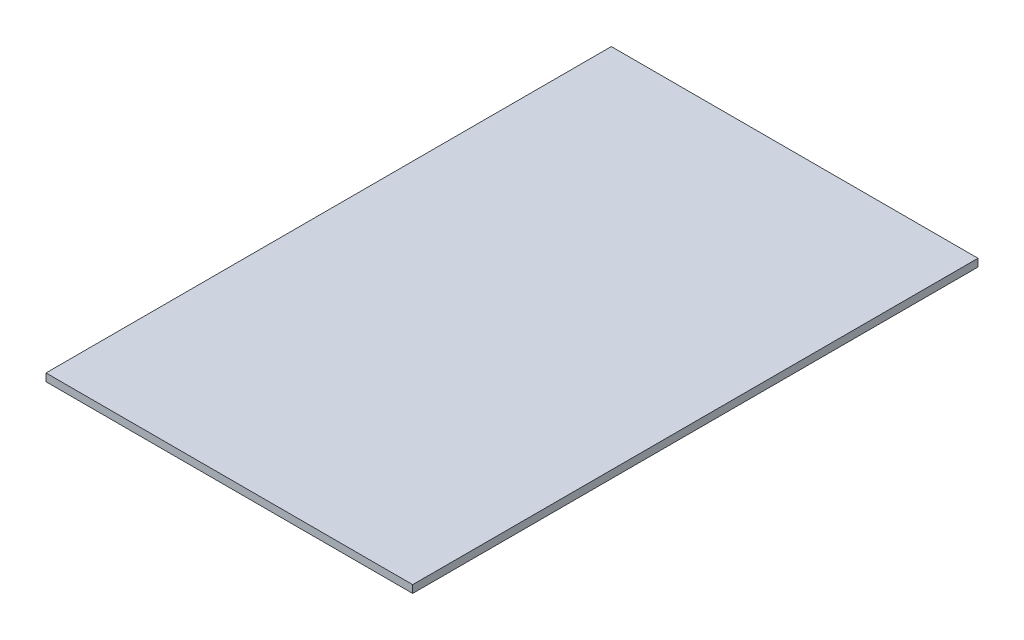
ISO-10303-21;
HEADER;
FILE_DESCRIPTION(('STEP AP214'),'2;1');
FILE_NAME('part.step','',(''),(''),'','','');
FILE_SCHEMA(('AUTOMOTIVE_DESIGN { 1 0 10303 214 1 1 1 1 }'));
ENDSEC;
DATA;
#1=APPLICATION_CONTEXT('core data for automotive mechanical design processes');
#2=APPLICATION_PROTOCOL_DEFINITION('international standard','automotive_design',2000,#1);
#3=PRODUCT_CONTEXT('',#1,'mechanical');
#4=PRODUCT('Part','Part','',(#3));
#5=PRODUCT_RELATED_PRODUCT_CATEGORY('part','',(#4));
#6=PRODUCT_DEFINITION_FORMATION('','',#4);
#7=PRODUCT_DEFINITION_CONTEXT('part definition',#1,'design');
#8=PRODUCT_DEFINITION('design','',#6,#7);
#9=PRODUCT_DEFINITION_SHAPE('','',#8);
#10=(LENGTH_UNIT() NAMED_UNIT(*) SI_UNIT(.MILLI.,.METRE.));
#11=(NAMED_UNIT(*) PLANE_ANGLE_UNIT() SI_UNIT($,.RADIAN.));
#12=(NAMED_UNIT(*) SI_UNIT($,.STERADIAN.) SOLID_ANGLE_UNIT());
#13=UNCERTAINTY_MEASURE_WITH_UNIT(LENGTH_MEASURE(1.E-05),#10,'distance_accuracy_value','');
#14=(GEOMETRIC_REPRESENTATION_CONTEXT(3) GLOBAL_UNCERTAINTY_ASSIGNED_CONTEXT((#13)) GLOBAL_UNIT_ASSIGNED_CONTEXT((#10,
#11,#12)) REPRESENTATION_CONTEXT('',''));
#15=CARTESIAN_POINT('',(0.,0.,0.));
#16=DIRECTION('',(0.,0.,1.));
#17=DIRECTION('',(1.,0.,0.));
#18=AXIS2_PLACEMENT_3D('',#15,#16,#17);
#19=CARTESIAN_POINT('',(0.,6.35,0.));
#20=DIRECTION('',(1.,0.,0.));
#21=DIRECTION('',(0.,0.,-1.));
#22=AXIS2_PLACEMENT_3D('',#19,#20,#21);
#23=PLANE('',#22);
#24=DIRECTION('',(0.,0.,1.));
#25=VECTOR('',#24,1.);
#26=CARTESIAN_POINT('',(0.,0.,0.));
#27=LINE('',#26,#25);
#28=CARTESIAN_POINT('',(0.,0.,-469.9));
#29=VERTEX_POINT('',#28);
#30=CARTESIAN_POINT('',(0.,0.,0.));
#31=VERTEX_POINT('',#30);
#32=EDGE_CURVE('E96',#29,#31,#27,.T.);
#33=ORIENTED_EDGE('',*,*,#32,.T.);
#34=DIRECTION('',(0.,-1.,0.));
#35=VECTOR('',#34,1.);
#36=CARTESIAN_POINT('',(0.,6.35,0.));
#37=LINE('',#36,#35);
#38=CARTESIAN_POINT('',(0.,6.35,0.));
#39=VERTEX_POINT('',#38);
#40=EDGE_CURVE('E11',#39,#31,#37,.T.);
#41=ORIENTED_EDGE('',*,*,#40,.F.);
#42=DIRECTION('',(0.,0.,1.));
#43=VECTOR('',#42,1.);
#44=CARTESIAN_POINT('',(0.,6.35,0.));
#45=LINE('',#44,#43);
#46=CARTESIAN_POINT('',(0.,6.35,-469.9));
#47=VERTEX_POINT('',#46);
#48=EDGE_CURVE('E84',#47,#39,#45,.T.);
#49=ORIENTED_EDGE('',*,*,#48,.F.);
#50=DIRECTION('',(0.,-1.,0.));
#51=VECTOR('',#50,1.);
#52=CARTESIAN_POINT('',(0.,6.35,-469.9));
#53=LINE('',#52,#51);
#54=EDGE_CURVE('E92',#47,#29,#53,.T.);
#55=ORIENTED_EDGE('',*,*,#54,.T.);
#56=EDGE_LOOP('',(#33,#41,#49,#55));
#57=FACE_BOUND('',#56,.T.);
#58=ADVANCED_FACE('F33',(#57),#23,.F.);
#59=CARTESIAN_POINT('',(0.,6.35,0.));
#60=DIRECTION('',(0.,0.,-1.));
#61=DIRECTION('',(-1.,0.,0.));
#62=AXIS2_PLACEMENT_3D('',#59,#60,#61);
#63=PLANE('',#62);
#64=DIRECTION('',(1.,0.,0.));
#65=VECTOR('',#64,1.);
#66=CARTESIAN_POINT('',(0.,0.,0.));
#67=LINE('',#66,#65);
#68=CARTESIAN_POINT('',(304.8,0.,0.));
#69=VERTEX_POINT('',#68);
#70=EDGE_CURVE('E88',#31,#69,#67,.T.);
#71=ORIENTED_EDGE('',*,*,#70,.T.);
#72=DIRECTION('',(0.,-1.,0.));
#73=VECTOR('',#72,1.);
#74=CARTESIAN_POINT('',(304.8,6.35,0.));
#75=LINE('',#74,#73);
#76=CARTESIAN_POINT('',(304.8,6.35,0.));
#77=VERTEX_POINT('',#76);
#78=EDGE_CURVE('E41',#77,#69,#75,.T.);
#79=ORIENTED_EDGE('',*,*,#78,.F.);
#80=DIRECTION('',(1.,0.,0.));
#81=VECTOR('',#80,1.);
#82=CARTESIAN_POINT('',(0.,6.35,0.));
#83=LINE('',#82,#81);
#84=EDGE_CURVE('E79',#39,#77,#83,.T.);
#85=ORIENTED_EDGE('',*,*,#84,.F.);
#86=ORIENTED_EDGE('',*,*,#40,.T.);
#87=EDGE_LOOP('',(#71,#79,#85,#86));
#88=FACE_BOUND('',#87,.T.);
#89=ADVANCED_FACE('F87',(#88),#63,.F.);
#90=CARTESIAN_POINT('',(304.8,6.35,0.));
#91=DIRECTION('',(-1.,0.,0.));
#92=DIRECTION('',(0.,0.,1.));
#93=AXIS2_PLACEMENT_3D('',#90,#91,#92);
#94=PLANE('',#93);
#95=DIRECTION('',(0.,0.,-1.));
#96=VECTOR('',#95,1.);
#97=CARTESIAN_POINT('',(304.8,0.,0.));
#98=LINE('',#97,#96);
#99=CARTESIAN_POINT('',(304.8,0.,-469.9));
#100=VERTEX_POINT('',#99);
#101=EDGE_CURVE('E66',#69,#100,#98,.T.);
#102=ORIENTED_EDGE('',*,*,#101,.T.);
#103=DIRECTION('',(0.,-1.,0.));
#104=VECTOR('',#103,1.);
#105=CARTESIAN_POINT('',(304.8,6.35,-469.9));
#106=LINE('',#105,#104);
#107=CARTESIAN_POINT('',(304.8,6.35,-469.9));
#108=VERTEX_POINT('',#107);
#109=EDGE_CURVE('E89',#108,#100,#106,.T.);
#110=ORIENTED_EDGE('',*,*,#109,.F.);
#111=DIRECTION('',(0.,0.,-1.));
#112=VECTOR('',#111,1.);
#113=CARTESIAN_POINT('',(304.8,6.35,0.));
#114=LINE('',#113,#112);
#115=EDGE_CURVE('E82',#77,#108,#114,.T.);
#116=ORIENTED_EDGE('',*,*,#115,.F.);
#117=ORIENTED_EDGE('',*,*,#78,.T.);
#118=EDGE_LOOP('',(#102,#110,#116,#117));
#119=FACE_BOUND('',#118,.T.);
#120=ADVANCED_FACE('F90',(#119),#94,.F.);
#121=CARTESIAN_POINT('',(0.,6.35,-469.9));
#122=DIRECTION('',(0.,0.,1.));
#123=DIRECTION('',(1.,0.,0.));
#124=AXIS2_PLACEMENT_3D('',#121,#122,#123);
#125=PLANE('',#124);
#126=DIRECTION('',(-1.,0.,0.));
#127=VECTOR('',#126,1.);
#128=CARTESIAN_POINT('',(0.,0.,-469.9));
#129=LINE('',#128,#127);
#130=EDGE_CURVE('E72',#100,#29,#129,.T.);
#131=ORIENTED_EDGE('',*,*,#130,.T.);
#132=ORIENTED_EDGE('',*,*,#54,.F.);
#133=DIRECTION('',(-1.,0.,0.));
#134=VECTOR('',#133,1.);
#135=CARTESIAN_POINT('',(0.,6.35,-469.9));
#136=LINE('',#135,#134);
#137=EDGE_CURVE('E49',#108,#47,#136,.T.);
#138=ORIENTED_EDGE('',*,*,#137,.F.);
#139=ORIENTED_EDGE('',*,*,#109,.T.);
#140=EDGE_LOOP('',(#131,#132,#138,#139));
#141=FACE_BOUND('',#140,.T.);
#142=ADVANCED_FACE('F103',(#141),#125,.F.);
#143=CARTESIAN_POINT('',(0.,6.35,0.));
#144=DIRECTION('',(0.,-1.,0.));
#145=DIRECTION('',(0.,0.,-1.));
#146=AXIS2_PLACEMENT_3D('',#143,#144,#145);
#147=PLANE('',#146);
#148=ORIENTED_EDGE('',*,*,#48,.T.);
#149=ORIENTED_EDGE('',*,*,#84,.T.);
#150=ORIENTED_EDGE('',*,*,#115,.T.);
#151=ORIENTED_EDGE('',*,*,#137,.T.);
#152=EDGE_LOOP('',(#148,#149,#150,#151));
#153=FACE_BOUND('',#152,.T.);
#154=ADVANCED_FACE('F80',(#153),#147,.F.);
#155=CARTESIAN_POINT('',(0.,0.,0.));
#156=DIRECTION('',(0.,-1.,0.));
#157=DIRECTION('',(0.,0.,-1.));
#158=AXIS2_PLACEMENT_3D('',#155,#156,#157);
#159=PLANE('',#158);
#160=ORIENTED_EDGE('',*,*,#32,.F.);
#161=ORIENTED_EDGE('',*,*,#130,.F.);
#162=ORIENTED_EDGE('',*,*,#101,.F.);
#163=ORIENTED_EDGE('',*,*,#70,.F.);
#164=EDGE_LOOP('',(#160,#161,#162,#163));
#165=FACE_BOUND('',#164,.T.);
#166=ADVANCED_FACE('F106',(#165),#159,.T.);
#167=CLOSED_SHELL('',(#58,#89,#120,#142,#154,#166));
#168=MANIFOLD_SOLID_BREP('B2',#167);
#169=ADVANCED_BREP_SHAPE_REPRESENTATION('',(#18,#168),#14);
#170=SHAPE_DEFINITION_REPRESENTATION(#9,#169);
ENDSEC;
END-ISO-10303-21;
